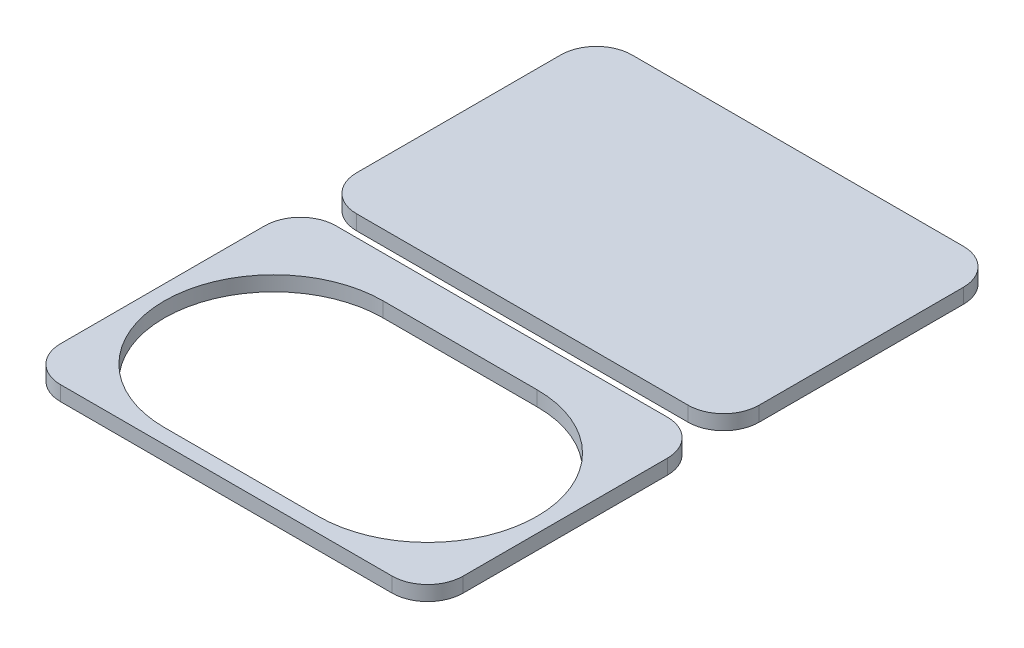
ISO-10303-21;
HEADER;
FILE_DESCRIPTION(('STEP AP214'),'2;1');
FILE_NAME('part.step','',(''),(''),'','','');
FILE_SCHEMA(('AUTOMOTIVE_DESIGN { 1 0 10303 214 1 1 1 1 }'));
ENDSEC;
DATA;
#1=APPLICATION_CONTEXT('core data for automotive mechanical design processes');
#2=APPLICATION_PROTOCOL_DEFINITION('international standard','automotive_design',2000,#1);
#3=PRODUCT_CONTEXT('',#1,'mechanical');
#4=PRODUCT('Part','Part','',(#3));
#5=PRODUCT_RELATED_PRODUCT_CATEGORY('part','',(#4));
#6=PRODUCT_DEFINITION_FORMATION('','',#4);
#7=PRODUCT_DEFINITION_CONTEXT('part definition',#1,'design');
#8=PRODUCT_DEFINITION('design','',#6,#7);
#9=PRODUCT_DEFINITION_SHAPE('','',#8);
#10=(LENGTH_UNIT() NAMED_UNIT(*) SI_UNIT(.MILLI.,.METRE.));
#11=(NAMED_UNIT(*) PLANE_ANGLE_UNIT() SI_UNIT($,.RADIAN.));
#12=(NAMED_UNIT(*) SI_UNIT($,.STERADIAN.) SOLID_ANGLE_UNIT());
#13=UNCERTAINTY_MEASURE_WITH_UNIT(LENGTH_MEASURE(1.E-05),#10,'distance_accuracy_value','');
#14=(GEOMETRIC_REPRESENTATION_CONTEXT(3) GLOBAL_UNCERTAINTY_ASSIGNED_CONTEXT((#13)) GLOBAL_UNIT_ASSIGNED_CONTEXT((#10,
#11,#12)) REPRESENTATION_CONTEXT('',''));
#15=CARTESIAN_POINT('',(0.,0.,0.));
#16=DIRECTION('',(0.,0.,1.));
#17=DIRECTION('',(1.,0.,0.));
#18=AXIS2_PLACEMENT_3D('',#15,#16,#17);
#19=CARTESIAN_POINT('',(0.,5.,-100.));
#20=DIRECTION('',(1.,0.,0.));
#21=DIRECTION('',(0.,0.,-1.));
#22=AXIS2_PLACEMENT_3D('',#19,#20,#21);
#23=PLANE('',#22);
#24=DIRECTION('',(0.,0.,1.));
#25=VECTOR('',#24,1.);
#26=CARTESIAN_POINT('',(0.,5.,-100.));
#27=LINE('',#26,#25);
#28=CARTESIAN_POINT('',(0.,5.,-181.));
#29=VERTEX_POINT('',#28);
#30=CARTESIAN_POINT('',(0.,5.,-112.));
#31=VERTEX_POINT('',#30);
#32=EDGE_CURVE('E128',#29,#31,#27,.T.);
#33=ORIENTED_EDGE('',*,*,#32,.F.);
#34=DIRECTION('',(0.,-1.,0.));
#35=VECTOR('',#34,1.);
#36=CARTESIAN_POINT('',(0.,5.,-181.));
#37=LINE('',#36,#35);
#38=CARTESIAN_POINT('',(0.,0.,-181.));
#39=VERTEX_POINT('',#38);
#40=EDGE_CURVE('E113',#29,#39,#37,.T.);
#41=ORIENTED_EDGE('',*,*,#40,.T.);
#42=DIRECTION('',(0.,0.,1.));
#43=VECTOR('',#42,1.);
#44=CARTESIAN_POINT('',(0.,0.,-100.));
#45=LINE('',#44,#43);
#46=CARTESIAN_POINT('',(0.,0.,-112.));
#47=VERTEX_POINT('',#46);
#48=EDGE_CURVE('E125',#39,#47,#45,.T.);
#49=ORIENTED_EDGE('',*,*,#48,.T.);
#50=DIRECTION('',(0.,-1.,0.));
#51=VECTOR('',#50,1.);
#52=CARTESIAN_POINT('',(0.,5.,-112.));
#53=LINE('',#52,#51);
#54=EDGE_CURVE('E130',#47,#31,#53,.F.);
#55=ORIENTED_EDGE('',*,*,#54,.T.);
#56=EDGE_LOOP('',(#33,#41,#49,#55));
#57=FACE_BOUND('',#56,.T.);
#58=ADVANCED_FACE('F43',(#57),#23,.F.);
#59=CARTESIAN_POINT('',(0.,5.,-100.));
#60=DIRECTION('',(0.,0.,-1.));
#61=DIRECTION('',(-1.,0.,0.));
#62=AXIS2_PLACEMENT_3D('',#59,#60,#61);
#63=PLANE('',#62);
#64=DIRECTION('',(1.,0.,0.));
#65=VECTOR('',#64,1.);
#66=CARTESIAN_POINT('',(0.,0.,-100.));
#67=LINE('',#66,#65);
#68=CARTESIAN_POINT('',(12.,0.,-100.));
#69=VERTEX_POINT('',#68);
#70=CARTESIAN_POINT('',(124.,0.,-100.));
#71=VERTEX_POINT('',#70);
#72=EDGE_CURVE('E134',#69,#71,#67,.T.);
#73=ORIENTED_EDGE('',*,*,#72,.T.);
#74=DIRECTION('',(0.,-1.,0.));
#75=VECTOR('',#74,1.);
#76=CARTESIAN_POINT('',(124.,5.,-100.));
#77=LINE('',#76,#75);
#78=CARTESIAN_POINT('',(124.,5.,-100.));
#79=VERTEX_POINT('',#78);
#80=EDGE_CURVE('E12',#71,#79,#77,.F.);
#81=ORIENTED_EDGE('',*,*,#80,.T.);
#82=DIRECTION('',(1.,0.,0.));
#83=VECTOR('',#82,1.);
#84=CARTESIAN_POINT('',(0.,5.,-100.));
#85=LINE('',#84,#83);
#86=CARTESIAN_POINT('',(12.,5.,-100.));
#87=VERTEX_POINT('',#86);
#88=EDGE_CURVE('E170',#87,#79,#85,.T.);
#89=ORIENTED_EDGE('',*,*,#88,.F.);
#90=DIRECTION('',(0.,-1.,0.));
#91=VECTOR('',#90,1.);
#92=CARTESIAN_POINT('',(12.,5.,-100.));
#93=LINE('',#92,#91);
#94=EDGE_CURVE('E51',#87,#69,#93,.T.);
#95=ORIENTED_EDGE('',*,*,#94,.T.);
#96=EDGE_LOOP('',(#73,#81,#89,#95));
#97=FACE_BOUND('',#96,.T.);
#98=ADVANCED_FACE('F168',(#97),#63,.F.);
#99=CARTESIAN_POINT('',(136.,5.,-100.));
#100=DIRECTION('',(-1.,0.,0.));
#101=DIRECTION('',(0.,0.,1.));
#102=AXIS2_PLACEMENT_3D('',#99,#100,#101);
#103=PLANE('',#102);
#104=DIRECTION('',(0.,0.,-1.));
#105=VECTOR('',#104,1.);
#106=CARTESIAN_POINT('',(136.,0.,-100.));
#107=LINE('',#106,#105);
#108=CARTESIAN_POINT('',(136.,0.,-112.));
#109=VERTEX_POINT('',#108);
#110=CARTESIAN_POINT('',(136.,0.,-181.));
#111=VERTEX_POINT('',#110);
#112=EDGE_CURVE('E137',#109,#111,#107,.T.);
#113=ORIENTED_EDGE('',*,*,#112,.T.);
#114=DIRECTION('',(0.,-1.,0.));
#115=VECTOR('',#114,1.);
#116=CARTESIAN_POINT('',(136.,5.,-181.));
#117=LINE('',#116,#115);
#118=CARTESIAN_POINT('',(136.,5.,-181.));
#119=VERTEX_POINT('',#118);
#120=EDGE_CURVE('E58',#111,#119,#117,.F.);
#121=ORIENTED_EDGE('',*,*,#120,.T.);
#122=DIRECTION('',(0.,0.,-1.));
#123=VECTOR('',#122,1.);
#124=CARTESIAN_POINT('',(136.,5.,-100.));
#125=LINE('',#124,#123);
#126=CARTESIAN_POINT('',(136.,5.,-112.));
#127=VERTEX_POINT('',#126);
#128=EDGE_CURVE('E178',#127,#119,#125,.T.);
#129=ORIENTED_EDGE('',*,*,#128,.F.);
#130=DIRECTION('',(0.,-1.,0.));
#131=VECTOR('',#130,1.);
#132=CARTESIAN_POINT('',(136.,5.,-112.));
#133=LINE('',#132,#131);
#134=EDGE_CURVE('E161',#127,#109,#133,.T.);
#135=ORIENTED_EDGE('',*,*,#134,.T.);
#136=EDGE_LOOP('',(#113,#121,#129,#135));
#137=FACE_BOUND('',#136,.T.);
#138=ADVANCED_FACE('F177',(#137),#103,.F.);
#139=CARTESIAN_POINT('',(0.,5.,-193.));
#140=DIRECTION('',(0.,0.,1.));
#141=DIRECTION('',(1.,0.,0.));
#142=AXIS2_PLACEMENT_3D('',#139,#140,#141);
#143=PLANE('',#142);
#144=DIRECTION('',(-1.,0.,0.));
#145=VECTOR('',#144,1.);
#146=CARTESIAN_POINT('',(0.,0.,-193.));
#147=LINE('',#146,#145);
#148=CARTESIAN_POINT('',(124.,0.,-193.));
#149=VERTEX_POINT('',#148);
#150=CARTESIAN_POINT('',(12.,0.,-193.));
#151=VERTEX_POINT('',#150);
#152=EDGE_CURVE('E144',#149,#151,#147,.T.);
#153=ORIENTED_EDGE('',*,*,#152,.T.);
#154=DIRECTION('',(0.,-1.,0.));
#155=VECTOR('',#154,1.);
#156=CARTESIAN_POINT('',(12.,5.,-193.));
#157=LINE('',#156,#155);
#158=CARTESIAN_POINT('',(12.,5.,-193.));
#159=VERTEX_POINT('',#158);
#160=EDGE_CURVE('E114',#151,#159,#157,.F.);
#161=ORIENTED_EDGE('',*,*,#160,.T.);
#162=DIRECTION('',(-1.,0.,0.));
#163=VECTOR('',#162,1.);
#164=CARTESIAN_POINT('',(0.,5.,-193.));
#165=LINE('',#164,#163);
#166=CARTESIAN_POINT('',(124.,5.,-193.));
#167=VERTEX_POINT('',#166);
#168=EDGE_CURVE('E140',#167,#159,#165,.T.);
#169=ORIENTED_EDGE('',*,*,#168,.F.);
#170=DIRECTION('',(0.,-1.,0.));
#171=VECTOR('',#170,1.);
#172=CARTESIAN_POINT('',(124.,5.,-193.));
#173=LINE('',#172,#171);
#174=EDGE_CURVE('E119',#167,#149,#173,.T.);
#175=ORIENTED_EDGE('',*,*,#174,.T.);
#176=EDGE_LOOP('',(#153,#161,#169,#175));
#177=FACE_BOUND('',#176,.T.);
#178=ADVANCED_FACE('F206',(#177),#143,.F.);
#179=CARTESIAN_POINT('',(0.,5.,-100.));
#180=DIRECTION('',(0.,-1.,0.));
#181=DIRECTION('',(0.,0.,-1.));
#182=AXIS2_PLACEMENT_3D('',#179,#180,#181);
#183=PLANE('',#182);
#184=ORIENTED_EDGE('',*,*,#168,.T.);
#185=CARTESIAN_POINT('',(12.,5.,-181.));
#186=DIRECTION('',(0.,-1.,0.));
#187=DIRECTION('',(0.,0.,-1.));
#188=AXIS2_PLACEMENT_3D('',#185,#186,#187);
#189=CIRCLE('',#188,12.);
#190=EDGE_CURVE('E159',#159,#29,#189,.F.);
#191=ORIENTED_EDGE('',*,*,#190,.T.);
#192=ORIENTED_EDGE('',*,*,#32,.T.);
#193=CARTESIAN_POINT('',(12.,5.,-112.));
#194=DIRECTION('',(0.,-1.,0.));
#195=DIRECTION('',(0.,0.,-1.));
#196=AXIS2_PLACEMENT_3D('',#193,#194,#195);
#197=CIRCLE('',#196,12.);
#198=EDGE_CURVE('E154',#31,#87,#197,.F.);
#199=ORIENTED_EDGE('',*,*,#198,.T.);
#200=ORIENTED_EDGE('',*,*,#88,.T.);
#201=CARTESIAN_POINT('',(124.,5.,-112.));
#202=DIRECTION('',(0.,-1.,0.));
#203=DIRECTION('',(0.,0.,-1.));
#204=AXIS2_PLACEMENT_3D('',#201,#202,#203);
#205=CIRCLE('',#204,12.);
#206=EDGE_CURVE('E65',#79,#127,#205,.F.);
#207=ORIENTED_EDGE('',*,*,#206,.T.);
#208=ORIENTED_EDGE('',*,*,#128,.T.);
#209=CARTESIAN_POINT('',(124.,5.,-181.));
#210=DIRECTION('',(0.,-1.,0.));
#211=DIRECTION('',(0.,0.,-1.));
#212=AXIS2_PLACEMENT_3D('',#209,#210,#211);
#213=CIRCLE('',#212,12.);
#214=EDGE_CURVE('E157',#119,#167,#213,.F.);
#215=ORIENTED_EDGE('',*,*,#214,.T.);
#216=EDGE_LOOP('',(#184,#191,#192,#199,#200,#207,#208,#215));
#217=FACE_BOUND('',#216,.T.);
#218=ADVANCED_FACE('F183',(#217),#183,.F.);
#219=CARTESIAN_POINT('',(0.,0.,-100.));
#220=DIRECTION('',(0.,-1.,0.));
#221=DIRECTION('',(0.,0.,-1.));
#222=AXIS2_PLACEMENT_3D('',#219,#220,#221);
#223=PLANE('',#222);
#224=ORIENTED_EDGE('',*,*,#48,.F.);
#225=CARTESIAN_POINT('',(12.,0.,-181.));
#226=DIRECTION('',(0.,-1.,0.));
#227=DIRECTION('',(0.,0.,-1.));
#228=AXIS2_PLACEMENT_3D('',#225,#226,#227);
#229=CIRCLE('',#228,12.);
#230=EDGE_CURVE('E109',#39,#151,#229,.T.);
#231=ORIENTED_EDGE('',*,*,#230,.T.);
#232=ORIENTED_EDGE('',*,*,#152,.F.);
#233=CARTESIAN_POINT('',(124.,0.,-181.));
#234=DIRECTION('',(0.,-1.,0.));
#235=DIRECTION('',(0.,0.,-1.));
#236=AXIS2_PLACEMENT_3D('',#233,#234,#235);
#237=CIRCLE('',#236,12.);
#238=EDGE_CURVE('E120',#149,#111,#237,.T.);
#239=ORIENTED_EDGE('',*,*,#238,.T.);
#240=ORIENTED_EDGE('',*,*,#112,.F.);
#241=CARTESIAN_POINT('',(124.,0.,-112.));
#242=DIRECTION('',(0.,-1.,0.));
#243=DIRECTION('',(0.,0.,-1.));
#244=AXIS2_PLACEMENT_3D('',#241,#242,#243);
#245=CIRCLE('',#244,12.);
#246=EDGE_CURVE('E148',#109,#71,#245,.T.);
#247=ORIENTED_EDGE('',*,*,#246,.T.);
#248=ORIENTED_EDGE('',*,*,#72,.F.);
#249=CARTESIAN_POINT('',(12.,0.,-112.));
#250=DIRECTION('',(0.,-1.,0.));
#251=DIRECTION('',(0.,0.,-1.));
#252=AXIS2_PLACEMENT_3D('',#249,#250,#251);
#253=CIRCLE('',#252,12.);
#254=EDGE_CURVE('E129',#69,#47,#253,.T.);
#255=ORIENTED_EDGE('',*,*,#254,.T.);
#256=EDGE_LOOP('',(#224,#231,#232,#239,#240,#247,#248,#255));
#257=FACE_BOUND('',#256,.T.);
#258=ADVANCED_FACE('F132',(#257),#223,.T.);
#259=CARTESIAN_POINT('',(12.,5.,-181.));
#260=DIRECTION('',(0.,-1.,0.));
#261=DIRECTION('',(0.,0.,-1.));
#262=AXIS2_PLACEMENT_3D('',#259,#260,#261);
#263=CYLINDRICAL_SURFACE('',#262,12.);
#264=ORIENTED_EDGE('',*,*,#190,.F.);
#265=ORIENTED_EDGE('',*,*,#160,.F.);
#266=ORIENTED_EDGE('',*,*,#230,.F.);
#267=ORIENTED_EDGE('',*,*,#40,.F.);
#268=EDGE_LOOP('',(#264,#265,#266,#267));
#269=FACE_BOUND('',#268,.T.);
#270=ADVANCED_FACE('F112',(#269),#263,.T.);
#271=CARTESIAN_POINT('',(124.,5.,-181.));
#272=DIRECTION('',(0.,-1.,0.));
#273=DIRECTION('',(0.,0.,-1.));
#274=AXIS2_PLACEMENT_3D('',#271,#272,#273);
#275=CYLINDRICAL_SURFACE('',#274,12.);
#276=ORIENTED_EDGE('',*,*,#214,.F.);
#277=ORIENTED_EDGE('',*,*,#120,.F.);
#278=ORIENTED_EDGE('',*,*,#238,.F.);
#279=ORIENTED_EDGE('',*,*,#174,.F.);
#280=EDGE_LOOP('',(#276,#277,#278,#279));
#281=FACE_BOUND('',#280,.T.);
#282=ADVANCED_FACE('F188',(#281),#275,.T.);
#283=CARTESIAN_POINT('',(124.,5.,-112.));
#284=DIRECTION('',(0.,-1.,0.));
#285=DIRECTION('',(0.,0.,-1.));
#286=AXIS2_PLACEMENT_3D('',#283,#284,#285);
#287=CYLINDRICAL_SURFACE('',#286,12.);
#288=ORIENTED_EDGE('',*,*,#206,.F.);
#289=ORIENTED_EDGE('',*,*,#80,.F.);
#290=ORIENTED_EDGE('',*,*,#246,.F.);
#291=ORIENTED_EDGE('',*,*,#134,.F.);
#292=EDGE_LOOP('',(#288,#289,#290,#291));
#293=FACE_BOUND('',#292,.T.);
#294=ADVANCED_FACE('F176',(#293),#287,.T.);
#295=CARTESIAN_POINT('',(12.,5.,-112.));
#296=DIRECTION('',(0.,-1.,0.));
#297=DIRECTION('',(0.,0.,-1.));
#298=AXIS2_PLACEMENT_3D('',#295,#296,#297);
#299=CYLINDRICAL_SURFACE('',#298,12.);
#300=ORIENTED_EDGE('',*,*,#198,.F.);
#301=ORIENTED_EDGE('',*,*,#54,.F.);
#302=ORIENTED_EDGE('',*,*,#254,.F.);
#303=ORIENTED_EDGE('',*,*,#94,.F.);
#304=EDGE_LOOP('',(#300,#301,#302,#303));
#305=FACE_BOUND('',#304,.T.);
#306=ADVANCED_FACE('F45',(#305),#299,.T.);
#307=CLOSED_SHELL('',(#58,#98,#138,#178,#218,#258,#270,#282,#294,#306));
#308=MANIFOLD_SOLID_BREP('B2',#307);
#309=CARTESIAN_POINT('',(0.,5.,0.));
#310=DIRECTION('',(1.,0.,0.));
#311=DIRECTION('',(0.,0.,-1.));
#312=AXIS2_PLACEMENT_3D('',#309,#310,#311);
#313=PLANE('',#312);
#314=DIRECTION('',(0.,0.,1.));
#315=VECTOR('',#314,1.);
#316=CARTESIAN_POINT('',(0.,5.,0.));
#317=LINE('',#316,#315);
#318=CARTESIAN_POINT('',(0.,5.,-81.));
#319=VERTEX_POINT('',#318);
#320=CARTESIAN_POINT('',(0.,5.,-12.));
#321=VERTEX_POINT('',#320);
#322=EDGE_CURVE('E396',#319,#321,#317,.T.);
#323=ORIENTED_EDGE('',*,*,#322,.F.);
#324=DIRECTION('',(0.,-1.,0.));
#325=VECTOR('',#324,1.);
#326=CARTESIAN_POINT('',(0.,5.,-81.));
#327=LINE('',#326,#325);
#328=CARTESIAN_POINT('',(0.,0.,-81.));
#329=VERTEX_POINT('',#328);
#330=EDGE_CURVE('E421',#319,#329,#327,.T.);
#331=ORIENTED_EDGE('',*,*,#330,.T.);
#332=DIRECTION('',(0.,0.,1.));
#333=VECTOR('',#332,1.);
#334=CARTESIAN_POINT('',(0.,0.,0.));
#335=LINE('',#334,#333);
#336=CARTESIAN_POINT('',(0.,0.,-12.));
#337=VERTEX_POINT('',#336);
#338=EDGE_CURVE('E392',#329,#337,#335,.T.);
#339=ORIENTED_EDGE('',*,*,#338,.T.);
#340=DIRECTION('',(0.,-1.,0.));
#341=VECTOR('',#340,1.);
#342=CARTESIAN_POINT('',(0.,5.,-12.));
#343=LINE('',#342,#341);
#344=EDGE_CURVE('E409',#337,#321,#343,.F.);
#345=ORIENTED_EDGE('',*,*,#344,.T.);
#346=EDGE_LOOP('',(#323,#331,#339,#345));
#347=FACE_BOUND('',#346,.T.);
#348=ADVANCED_FACE('F271',(#347),#313,.F.);
#349=CARTESIAN_POINT('',(0.,5.,0.));
#350=DIRECTION('',(0.,0.,-1.));
#351=DIRECTION('',(-1.,0.,0.));
#352=AXIS2_PLACEMENT_3D('',#349,#350,#351);
#353=PLANE('',#352);
#354=DIRECTION('',(1.,0.,0.));
#355=VECTOR('',#354,1.);
#356=CARTESIAN_POINT('',(0.,0.,0.));
#357=LINE('',#356,#355);
#358=CARTESIAN_POINT('',(12.,0.,0.));
#359=VERTEX_POINT('',#358);
#360=CARTESIAN_POINT('',(124.,0.,0.));
#361=VERTEX_POINT('',#360);
#362=EDGE_CURVE('E412',#359,#361,#357,.T.);
#363=ORIENTED_EDGE('',*,*,#362,.T.);
#364=DIRECTION('',(0.,-1.,0.));
#365=VECTOR('',#364,1.);
#366=CARTESIAN_POINT('',(124.,5.,0.));
#367=LINE('',#366,#365);
#368=CARTESIAN_POINT('',(124.,5.,0.));
#369=VERTEX_POINT('',#368);
#370=EDGE_CURVE('E41',#361,#369,#367,.F.);
#371=ORIENTED_EDGE('',*,*,#370,.T.);
#372=DIRECTION('',(1.,0.,0.));
#373=VECTOR('',#372,1.);
#374=CARTESIAN_POINT('',(0.,5.,0.));
#375=LINE('',#374,#373);
#376=CARTESIAN_POINT('',(12.,5.,0.));
#377=VERTEX_POINT('',#376);
#378=EDGE_CURVE('E399',#377,#369,#375,.T.);
#379=ORIENTED_EDGE('',*,*,#378,.F.);
#380=DIRECTION('',(0.,-1.,0.));
#381=VECTOR('',#380,1.);
#382=CARTESIAN_POINT('',(12.,5.,0.));
#383=LINE('',#382,#381);
#384=EDGE_CURVE('E279',#377,#359,#383,.T.);
#385=ORIENTED_EDGE('',*,*,#384,.T.);
#386=EDGE_LOOP('',(#363,#371,#379,#385));
#387=FACE_BOUND('',#386,.T.);
#388=ADVANCED_FACE('F454',(#387),#353,.F.);
#389=CARTESIAN_POINT('',(136.,5.,0.));
#390=DIRECTION('',(-1.,0.,0.));
#391=DIRECTION('',(0.,0.,1.));
#392=AXIS2_PLACEMENT_3D('',#389,#390,#391);
#393=PLANE('',#392);
#394=DIRECTION('',(0.,0.,-1.));
#395=VECTOR('',#394,1.);
#396=CARTESIAN_POINT('',(136.,0.,0.));
#397=LINE('',#396,#395);
#398=CARTESIAN_POINT('',(136.,0.,-12.));
#399=VERTEX_POINT('',#398);
#400=CARTESIAN_POINT('',(136.,0.,-81.));
#401=VERTEX_POINT('',#400);
#402=EDGE_CURVE('E415',#399,#401,#397,.T.);
#403=ORIENTED_EDGE('',*,*,#402,.T.);
#404=DIRECTION('',(0.,-1.,0.));
#405=VECTOR('',#404,1.);
#406=CARTESIAN_POINT('',(136.,5.,-81.));
#407=LINE('',#406,#405);
#408=CARTESIAN_POINT('',(136.,5.,-81.));
#409=VERTEX_POINT('',#408);
#410=EDGE_CURVE('E448',#401,#409,#407,.F.);
#411=ORIENTED_EDGE('',*,*,#410,.T.);
#412=DIRECTION('',(0.,0.,-1.));
#413=VECTOR('',#412,1.);
#414=CARTESIAN_POINT('',(136.,5.,0.));
#415=LINE('',#414,#413);
#416=CARTESIAN_POINT('',(136.,5.,-12.));
#417=VERTEX_POINT('',#416);
#418=EDGE_CURVE('E403',#417,#409,#415,.T.);
#419=ORIENTED_EDGE('',*,*,#418,.F.);
#420=DIRECTION('',(0.,-1.,0.));
#421=VECTOR('',#420,1.);
#422=CARTESIAN_POINT('',(136.,5.,-12.));
#423=LINE('',#422,#421);
#424=EDGE_CURVE('E445',#417,#399,#423,.T.);
#425=ORIENTED_EDGE('',*,*,#424,.T.);
#426=EDGE_LOOP('',(#403,#411,#419,#425));
#427=FACE_BOUND('',#426,.T.);
#428=ADVANCED_FACE('F466',(#427),#393,.F.);
#429=CARTESIAN_POINT('',(0.,5.,-93.));
#430=DIRECTION('',(0.,0.,1.));
#431=DIRECTION('',(1.,0.,0.));
#432=AXIS2_PLACEMENT_3D('',#429,#430,#431);
#433=PLANE('',#432);
#434=DIRECTION('',(-1.,0.,0.));
#435=VECTOR('',#434,1.);
#436=CARTESIAN_POINT('',(0.,0.,-93.));
#437=LINE('',#436,#435);
#438=CARTESIAN_POINT('',(124.,0.,-93.));
#439=VERTEX_POINT('',#438);
#440=CARTESIAN_POINT('',(12.,0.,-93.));
#441=VERTEX_POINT('',#440);
#442=EDGE_CURVE('E400',#439,#441,#437,.T.);
#443=ORIENTED_EDGE('',*,*,#442,.T.);
#444=DIRECTION('',(0.,-1.,0.));
#445=VECTOR('',#444,1.);
#446=CARTESIAN_POINT('',(12.,5.,-93.));
#447=LINE('',#446,#445);
#448=CARTESIAN_POINT('',(12.,5.,-93.));
#449=VERTEX_POINT('',#448);
#450=EDGE_CURVE('E435',#441,#449,#447,.F.);
#451=ORIENTED_EDGE('',*,*,#450,.T.);
#452=DIRECTION('',(-1.,0.,0.));
#453=VECTOR('',#452,1.);
#454=CARTESIAN_POINT('',(0.,5.,-93.));
#455=LINE('',#454,#453);
#456=CARTESIAN_POINT('',(124.,5.,-93.));
#457=VERTEX_POINT('',#456);
#458=EDGE_CURVE('E406',#457,#449,#455,.T.);
#459=ORIENTED_EDGE('',*,*,#458,.F.);
#460=DIRECTION('',(0.,-1.,0.));
#461=VECTOR('',#460,1.);
#462=CARTESIAN_POINT('',(124.,5.,-93.));
#463=LINE('',#462,#461);
#464=EDGE_CURVE('E432',#457,#439,#463,.T.);
#465=ORIENTED_EDGE('',*,*,#464,.T.);
#466=EDGE_LOOP('',(#443,#451,#459,#465));
#467=FACE_BOUND('',#466,.T.);
#468=ADVANCED_FACE('F477',(#467),#433,.F.);
#469=CARTESIAN_POINT('',(0.,5.,0.));
#470=DIRECTION('',(0.,-1.,0.));
#471=DIRECTION('',(0.,0.,-1.));
#472=AXIS2_PLACEMENT_3D('',#469,#470,#471);
#473=PLANE('',#472);
#474=DIRECTION('',(1.,0.,0.));
#475=VECTOR('',#474,1.);
#476=CARTESIAN_POINT('',(42.,5.,-4.99999999999998));
#477=LINE('',#476,#475);
#478=CARTESIAN_POINT('',(42.,5.,-4.99999999999998));
#479=VERTEX_POINT('',#478);
#480=CARTESIAN_POINT('',(94.,5.,-5.));
#481=VERTEX_POINT('',#480);
#482=EDGE_CURVE('E386',#479,#481,#477,.T.);
#483=ORIENTED_EDGE('',*,*,#482,.F.);
#484=CARTESIAN_POINT('',(42.,5.,-42.));
#485=DIRECTION('',(0.,1.,0.));
#486=DIRECTION('',(0.,0.,1.));
#487=AXIS2_PLACEMENT_3D('',#484,#485,#486);
#488=CIRCLE('',#487,37.);
#489=CARTESIAN_POINT('',(42.,5.,-79.));
#490=VERTEX_POINT('',#489);
#491=EDGE_CURVE('E286',#490,#479,#488,.T.);
#492=ORIENTED_EDGE('',*,*,#491,.F.);
#493=DIRECTION('',(-1.,0.,0.));
#494=VECTOR('',#493,1.);
#495=CARTESIAN_POINT('',(42.,5.,-79.));
#496=LINE('',#495,#494);
#497=CARTESIAN_POINT('',(94.,5.,-79.));
#498=VERTEX_POINT('',#497);
#499=EDGE_CURVE('E377',#498,#490,#496,.T.);
#500=ORIENTED_EDGE('',*,*,#499,.F.);
#501=CARTESIAN_POINT('',(94.,5.,-42.));
#502=DIRECTION('',(0.,1.,0.));
#503=DIRECTION('',(0.,0.,1.));
#504=AXIS2_PLACEMENT_3D('',#501,#502,#503);
#505=CIRCLE('',#504,37.);
#506=EDGE_CURVE('E380',#481,#498,#505,.T.);
#507=ORIENTED_EDGE('',*,*,#506,.F.);
#508=EDGE_LOOP('',(#483,#492,#500,#507));
#509=FACE_BOUND('',#508,.T.);
#510=ORIENTED_EDGE('',*,*,#458,.T.);
#511=CARTESIAN_POINT('',(12.,5.,-81.));
#512=DIRECTION('',(0.,-1.,0.));
#513=DIRECTION('',(0.,0.,-1.));
#514=AXIS2_PLACEMENT_3D('',#511,#512,#513);
#515=CIRCLE('',#514,12.);
#516=EDGE_CURVE('E443',#449,#319,#515,.F.);
#517=ORIENTED_EDGE('',*,*,#516,.T.);
#518=ORIENTED_EDGE('',*,*,#322,.T.);
#519=CARTESIAN_POINT('',(12.,5.,-12.));
#520=DIRECTION('',(0.,-1.,0.));
#521=DIRECTION('',(0.,0.,-1.));
#522=AXIS2_PLACEMENT_3D('',#519,#520,#521);
#523=CIRCLE('',#522,12.);
#524=EDGE_CURVE('E437',#321,#377,#523,.F.);
#525=ORIENTED_EDGE('',*,*,#524,.T.);
#526=ORIENTED_EDGE('',*,*,#378,.T.);
#527=CARTESIAN_POINT('',(124.,5.,-12.));
#528=DIRECTION('',(0.,-1.,0.));
#529=DIRECTION('',(0.,0.,-1.));
#530=AXIS2_PLACEMENT_3D('',#527,#528,#529);
#531=CIRCLE('',#530,12.);
#532=EDGE_CURVE('E439',#369,#417,#531,.F.);
#533=ORIENTED_EDGE('',*,*,#532,.T.);
#534=ORIENTED_EDGE('',*,*,#418,.T.);
#535=CARTESIAN_POINT('',(124.,5.,-81.));
#536=DIRECTION('',(0.,-1.,0.));
#537=DIRECTION('',(0.,0.,-1.));
#538=AXIS2_PLACEMENT_3D('',#535,#536,#537);
#539=CIRCLE('',#538,12.);
#540=EDGE_CURVE('E441',#409,#457,#539,.F.);
#541=ORIENTED_EDGE('',*,*,#540,.T.);
#542=EDGE_LOOP('',(#510,#517,#518,#525,#526,#533,#534,#541));
#543=FACE_BOUND('',#542,.T.);
#544=ADVANCED_FACE('F470',(#509,#543),#473,.F.);
#545=CARTESIAN_POINT('',(0.,0.,0.));
#546=DIRECTION('',(0.,-1.,0.));
#547=DIRECTION('',(0.,0.,-1.));
#548=AXIS2_PLACEMENT_3D('',#545,#546,#547);
#549=PLANE('',#548);
#550=CARTESIAN_POINT('',(42.,0.,-42.));
#551=DIRECTION('',(0.,1.,0.));
#552=DIRECTION('',(0.,0.,1.));
#553=AXIS2_PLACEMENT_3D('',#550,#551,#552);
#554=CIRCLE('',#553,37.);
#555=CARTESIAN_POINT('',(42.,0.,-79.));
#556=VERTEX_POINT('',#555);
#557=CARTESIAN_POINT('',(42.,0.,-4.99999999999998));
#558=VERTEX_POINT('',#557);
#559=EDGE_CURVE('E361',#556,#558,#554,.T.);
#560=ORIENTED_EDGE('',*,*,#559,.T.);
#561=DIRECTION('',(1.,0.,0.));
#562=VECTOR('',#561,1.);
#563=CARTESIAN_POINT('',(42.,0.,-4.99999999999998));
#564=LINE('',#563,#562);
#565=CARTESIAN_POINT('',(94.,0.,-5.));
#566=VERTEX_POINT('',#565);
#567=EDGE_CURVE('E370',#558,#566,#564,.T.);
#568=ORIENTED_EDGE('',*,*,#567,.T.);
#569=CARTESIAN_POINT('',(94.,0.,-42.));
#570=DIRECTION('',(0.,1.,0.));
#571=DIRECTION('',(0.,0.,1.));
#572=AXIS2_PLACEMENT_3D('',#569,#570,#571);
#573=CIRCLE('',#572,37.);
#574=CARTESIAN_POINT('',(94.,0.,-79.));
#575=VERTEX_POINT('',#574);
#576=EDGE_CURVE('E294',#566,#575,#573,.T.);
#577=ORIENTED_EDGE('',*,*,#576,.T.);
#578=DIRECTION('',(-1.,0.,0.));
#579=VECTOR('',#578,1.);
#580=CARTESIAN_POINT('',(42.,0.,-79.));
#581=LINE('',#580,#579);
#582=EDGE_CURVE('E367',#575,#556,#581,.T.);
#583=ORIENTED_EDGE('',*,*,#582,.T.);
#584=EDGE_LOOP('',(#560,#568,#577,#583));
#585=FACE_BOUND('',#584,.T.);
#586=ORIENTED_EDGE('',*,*,#338,.F.);
#587=CARTESIAN_POINT('',(12.,0.,-81.));
#588=DIRECTION('',(0.,-1.,0.));
#589=DIRECTION('',(0.,0.,-1.));
#590=AXIS2_PLACEMENT_3D('',#587,#588,#589);
#591=CIRCLE('',#590,12.);
#592=EDGE_CURVE('E430',#329,#441,#591,.T.);
#593=ORIENTED_EDGE('',*,*,#592,.T.);
#594=ORIENTED_EDGE('',*,*,#442,.F.);
#595=CARTESIAN_POINT('',(124.,0.,-81.));
#596=DIRECTION('',(0.,-1.,0.));
#597=DIRECTION('',(0.,0.,-1.));
#598=AXIS2_PLACEMENT_3D('',#595,#596,#597);
#599=CIRCLE('',#598,12.);
#600=EDGE_CURVE('E428',#439,#401,#599,.T.);
#601=ORIENTED_EDGE('',*,*,#600,.T.);
#602=ORIENTED_EDGE('',*,*,#402,.F.);
#603=CARTESIAN_POINT('',(124.,0.,-12.));
#604=DIRECTION('',(0.,-1.,0.));
#605=DIRECTION('',(0.,0.,-1.));
#606=AXIS2_PLACEMENT_3D('',#603,#604,#605);
#607=CIRCLE('',#606,12.);
#608=EDGE_CURVE('E426',#399,#361,#607,.T.);
#609=ORIENTED_EDGE('',*,*,#608,.T.);
#610=ORIENTED_EDGE('',*,*,#362,.F.);
#611=CARTESIAN_POINT('',(12.,0.,-12.));
#612=DIRECTION('',(0.,-1.,0.));
#613=DIRECTION('',(0.,0.,-1.));
#614=AXIS2_PLACEMENT_3D('',#611,#612,#613);
#615=CIRCLE('',#614,12.);
#616=EDGE_CURVE('E424',#359,#337,#615,.T.);
#617=ORIENTED_EDGE('',*,*,#616,.T.);
#618=EDGE_LOOP('',(#586,#593,#594,#601,#602,#609,#610,#617));
#619=FACE_BOUND('',#618,.T.);
#620=ADVANCED_FACE('F374',(#585,#619),#549,.T.);
#621=CARTESIAN_POINT('',(12.,5.,-81.));
#622=DIRECTION('',(0.,-1.,0.));
#623=DIRECTION('',(0.,0.,-1.));
#624=AXIS2_PLACEMENT_3D('',#621,#622,#623);
#625=CYLINDRICAL_SURFACE('',#624,12.);
#626=ORIENTED_EDGE('',*,*,#516,.F.);
#627=ORIENTED_EDGE('',*,*,#450,.F.);
#628=ORIENTED_EDGE('',*,*,#592,.F.);
#629=ORIENTED_EDGE('',*,*,#330,.F.);
#630=EDGE_LOOP('',(#626,#627,#628,#629));
#631=FACE_BOUND('',#630,.T.);
#632=ADVANCED_FACE('F482',(#631),#625,.T.);
#633=CARTESIAN_POINT('',(124.,5.,-81.));
#634=DIRECTION('',(0.,-1.,0.));
#635=DIRECTION('',(0.,0.,-1.));
#636=AXIS2_PLACEMENT_3D('',#633,#634,#635);
#637=CYLINDRICAL_SURFACE('',#636,12.);
#638=ORIENTED_EDGE('',*,*,#540,.F.);
#639=ORIENTED_EDGE('',*,*,#410,.F.);
#640=ORIENTED_EDGE('',*,*,#600,.F.);
#641=ORIENTED_EDGE('',*,*,#464,.F.);
#642=EDGE_LOOP('',(#638,#639,#640,#641));
#643=FACE_BOUND('',#642,.T.);
#644=ADVANCED_FACE('F474',(#643),#637,.T.);
#645=CARTESIAN_POINT('',(124.,5.,-12.));
#646=DIRECTION('',(0.,-1.,0.));
#647=DIRECTION('',(0.,0.,-1.));
#648=AXIS2_PLACEMENT_3D('',#645,#646,#647);
#649=CYLINDRICAL_SURFACE('',#648,12.);
#650=ORIENTED_EDGE('',*,*,#532,.F.);
#651=ORIENTED_EDGE('',*,*,#370,.F.);
#652=ORIENTED_EDGE('',*,*,#608,.F.);
#653=ORIENTED_EDGE('',*,*,#424,.F.);
#654=EDGE_LOOP('',(#650,#651,#652,#653));
#655=FACE_BOUND('',#654,.T.);
#656=ADVANCED_FACE('F463',(#655),#649,.T.);
#657=CARTESIAN_POINT('',(12.,5.,-12.));
#658=DIRECTION('',(0.,-1.,0.));
#659=DIRECTION('',(0.,0.,-1.));
#660=AXIS2_PLACEMENT_3D('',#657,#658,#659);
#661=CYLINDRICAL_SURFACE('',#660,12.);
#662=ORIENTED_EDGE('',*,*,#524,.F.);
#663=ORIENTED_EDGE('',*,*,#344,.F.);
#664=ORIENTED_EDGE('',*,*,#616,.F.);
#665=ORIENTED_EDGE('',*,*,#384,.F.);
#666=EDGE_LOOP('',(#662,#663,#664,#665));
#667=FACE_BOUND('',#666,.T.);
#668=ADVANCED_FACE('F273',(#667),#661,.T.);
#669=CARTESIAN_POINT('',(42.,0.,-42.));
#670=DIRECTION('',(0.,1.,0.));
#671=DIRECTION('',(0.,0.,1.));
#672=AXIS2_PLACEMENT_3D('',#669,#670,#671);
#673=CYLINDRICAL_SURFACE('',#672,37.);
#674=ORIENTED_EDGE('',*,*,#491,.T.);
#675=DIRECTION('',(0.,1.,0.));
#676=VECTOR('',#675,1.);
#677=CARTESIAN_POINT('',(42.,0.,-4.99999999999998));
#678=LINE('',#677,#676);
#679=EDGE_CURVE('E357',#558,#479,#678,.T.);
#680=ORIENTED_EDGE('',*,*,#679,.F.);
#681=ORIENTED_EDGE('',*,*,#559,.F.);
#682=DIRECTION('',(0.,1.,0.));
#683=VECTOR('',#682,1.);
#684=CARTESIAN_POINT('',(42.,0.,-79.));
#685=LINE('',#684,#683);
#686=EDGE_CURVE('E390',#556,#490,#685,.T.);
#687=ORIENTED_EDGE('',*,*,#686,.T.);
#688=EDGE_LOOP('',(#674,#680,#681,#687));
#689=FACE_BOUND('',#688,.T.);
#690=ADVANCED_FACE('F359',(#689),#673,.F.);
#691=CARTESIAN_POINT('',(42.,0.,-79.));
#692=DIRECTION('',(0.,0.,-1.));
#693=DIRECTION('',(-1.,0.,0.));
#694=AXIS2_PLACEMENT_3D('',#691,#692,#693);
#695=PLANE('',#694);
#696=ORIENTED_EDGE('',*,*,#499,.T.);
#697=ORIENTED_EDGE('',*,*,#686,.F.);
#698=ORIENTED_EDGE('',*,*,#582,.F.);
#699=DIRECTION('',(0.,1.,0.));
#700=VECTOR('',#699,1.);
#701=CARTESIAN_POINT('',(94.,0.,-79.));
#702=LINE('',#701,#700);
#703=EDGE_CURVE('E393',#575,#498,#702,.T.);
#704=ORIENTED_EDGE('',*,*,#703,.T.);
#705=EDGE_LOOP('',(#696,#697,#698,#704));
#706=FACE_BOUND('',#705,.T.);
#707=ADVANCED_FACE('F491',(#706),#695,.F.);
#708=CARTESIAN_POINT('',(94.,0.,-42.));
#709=DIRECTION('',(0.,1.,0.));
#710=DIRECTION('',(0.,0.,1.));
#711=AXIS2_PLACEMENT_3D('',#708,#709,#710);
#712=CYLINDRICAL_SURFACE('',#711,37.);
#713=ORIENTED_EDGE('',*,*,#506,.T.);
#714=ORIENTED_EDGE('',*,*,#703,.F.);
#715=ORIENTED_EDGE('',*,*,#576,.F.);
#716=DIRECTION('',(0.,1.,0.));
#717=VECTOR('',#716,1.);
#718=CARTESIAN_POINT('',(94.,0.,-5.));
#719=LINE('',#718,#717);
#720=EDGE_CURVE('E366',#566,#481,#719,.T.);
#721=ORIENTED_EDGE('',*,*,#720,.T.);
#722=EDGE_LOOP('',(#713,#714,#715,#721));
#723=FACE_BOUND('',#722,.T.);
#724=ADVANCED_FACE('F551',(#723),#712,.F.);
#725=CARTESIAN_POINT('',(42.,0.,-4.99999999999998));
#726=DIRECTION('',(0.,0.,1.));
#727=DIRECTION('',(1.,0.,0.));
#728=AXIS2_PLACEMENT_3D('',#725,#726,#727);
#729=PLANE('',#728);
#730=ORIENTED_EDGE('',*,*,#482,.T.);
#731=ORIENTED_EDGE('',*,*,#720,.F.);
#732=ORIENTED_EDGE('',*,*,#567,.F.);
#733=ORIENTED_EDGE('',*,*,#679,.T.);
#734=EDGE_LOOP('',(#730,#731,#732,#733));
#735=FACE_BOUND('',#734,.T.);
#736=ADVANCED_FACE('F371',(#735),#729,.F.);
#737=CLOSED_SHELL('',(#348,#388,#428,#468,#544,#620,#632,#644,#656,#668,#690,#707,#724,#736));
#738=MANIFOLD_SOLID_BREP('B6',#737);
#739=ADVANCED_BREP_SHAPE_REPRESENTATION('',(#18,#308,#738),#14);
#740=SHAPE_DEFINITION_REPRESENTATION(#9,#739);
ENDSEC;
END-ISO-10303-21;
